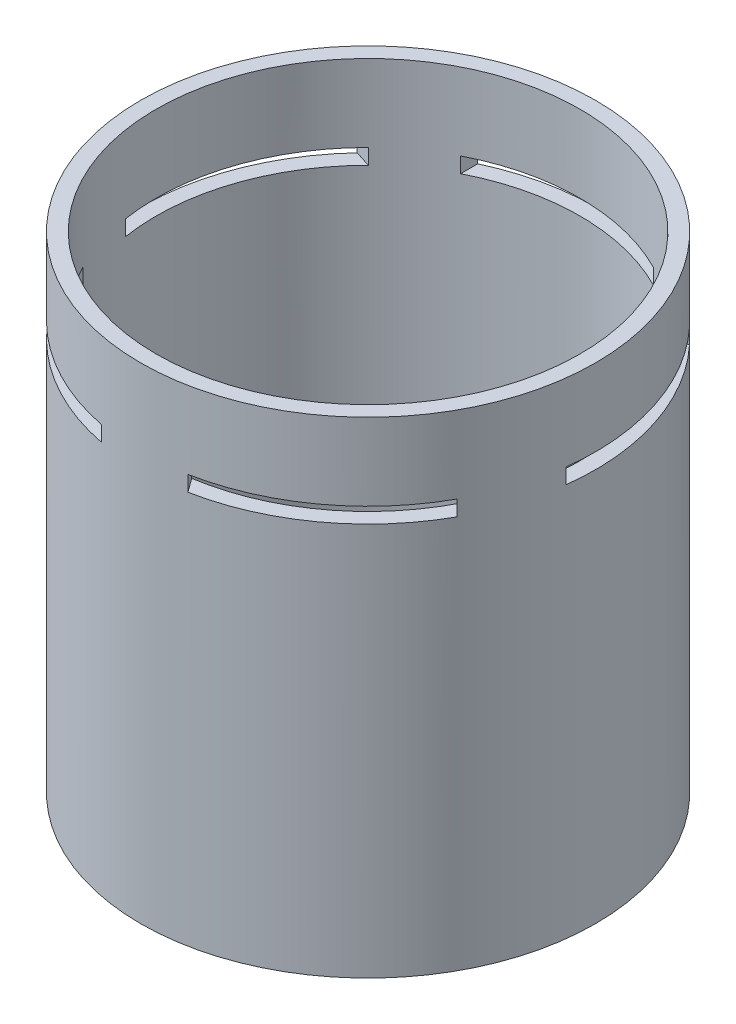
ISO-10303-21;
HEADER;
FILE_DESCRIPTION(('STEP AP214'),'2;1');
FILE_NAME('part.step','',(''),(''),'','','');
FILE_SCHEMA(('AUTOMOTIVE_DESIGN { 1 0 10303 214 1 1 1 1 }'));
ENDSEC;
DATA;
#1=APPLICATION_CONTEXT('core data for automotive mechanical design processes');
#2=APPLICATION_PROTOCOL_DEFINITION('international standard','automotive_design',2000,#1);
#3=PRODUCT_CONTEXT('',#1,'mechanical');
#4=PRODUCT('Part','Part','',(#3));
#5=PRODUCT_RELATED_PRODUCT_CATEGORY('part','',(#4));
#6=PRODUCT_DEFINITION_FORMATION('','',#4);
#7=PRODUCT_DEFINITION_CONTEXT('part definition',#1,'design');
#8=PRODUCT_DEFINITION('design','',#6,#7);
#9=PRODUCT_DEFINITION_SHAPE('','',#8);
#10=(LENGTH_UNIT() NAMED_UNIT(*) SI_UNIT(.MILLI.,.METRE.));
#11=(NAMED_UNIT(*) PLANE_ANGLE_UNIT() SI_UNIT($,.RADIAN.));
#12=(NAMED_UNIT(*) SI_UNIT($,.STERADIAN.) SOLID_ANGLE_UNIT());
#13=UNCERTAINTY_MEASURE_WITH_UNIT(LENGTH_MEASURE(1.E-05),#10,'distance_accuracy_value','');
#14=(GEOMETRIC_REPRESENTATION_CONTEXT(3) GLOBAL_UNCERTAINTY_ASSIGNED_CONTEXT((#13)) GLOBAL_UNIT_ASSIGNED_CONTEXT((#10,
#11,#12)) REPRESENTATION_CONTEXT('',''));
#15=CARTESIAN_POINT('',(0.,0.,0.));
#16=DIRECTION('',(0.,0.,1.));
#17=DIRECTION('',(1.,0.,0.));
#18=AXIS2_PLACEMENT_3D('',#15,#16,#17);
#19=CARTESIAN_POINT('',(0.,63.,0.));
#20=DIRECTION('',(0.,1.,0.));
#21=DIRECTION('',(0.,0.,1.));
#22=AXIS2_PLACEMENT_3D('',#19,#20,#21);
#23=PLANE('',#22);
#24=CARTESIAN_POINT('',(0.,63.,0.));
#25=DIRECTION('',(0.,1.,0.));
#26=DIRECTION('',(0.,0.,1.));
#27=AXIS2_PLACEMENT_3D('',#24,#25,#26);
#28=CIRCLE('',#27,29.5);
#29=CARTESIAN_POINT('',(0.,63.,29.5));
#30=VERTEX_POINT('',#29);
#31=EDGE_CURVE('E319',#30,#30,#28,.T.);
#32=ORIENTED_EDGE('',*,*,#31,.T.);
#33=EDGE_LOOP('',(#32));
#34=FACE_BOUND('',#33,.T.);
#35=CARTESIAN_POINT('',(0.,63.,0.));
#36=DIRECTION('',(0.,1.,0.));
#37=DIRECTION('',(0.,0.,1.));
#38=AXIS2_PLACEMENT_3D('',#35,#36,#37);
#39=CIRCLE('',#38,27.5);
#40=CARTESIAN_POINT('',(0.,63.,27.5));
#41=VERTEX_POINT('',#40);
#42=EDGE_CURVE('E313',#41,#41,#39,.T.);
#43=ORIENTED_EDGE('',*,*,#42,.F.);
#44=EDGE_LOOP('',(#43));
#45=FACE_BOUND('',#44,.T.);
#46=ADVANCED_FACE('F33',(#34,#45),#23,.T.);
#47=CARTESIAN_POINT('',(0.,0.,0.));
#48=DIRECTION('',(0.,1.,0.));
#49=DIRECTION('',(0.,0.,1.));
#50=AXIS2_PLACEMENT_3D('',#47,#48,#49);
#51=PLANE('',#50);
#52=CARTESIAN_POINT('',(0.,0.,0.));
#53=DIRECTION('',(0.,1.,0.));
#54=DIRECTION('',(0.,0.,1.));
#55=AXIS2_PLACEMENT_3D('',#52,#53,#54);
#56=CIRCLE('',#55,29.5);
#57=CARTESIAN_POINT('',(0.,0.,29.5));
#58=VERTEX_POINT('',#57);
#59=EDGE_CURVE('E316',#58,#58,#56,.T.);
#60=ORIENTED_EDGE('',*,*,#59,.F.);
#61=EDGE_LOOP('',(#60));
#62=FACE_BOUND('',#61,.T.);
#63=CARTESIAN_POINT('',(0.,0.,0.));
#64=DIRECTION('',(0.,1.,0.));
#65=DIRECTION('',(0.,0.,1.));
#66=AXIS2_PLACEMENT_3D('',#63,#64,#65);
#67=CIRCLE('',#66,27.5);
#68=CARTESIAN_POINT('',(0.,0.,27.5));
#69=VERTEX_POINT('',#68);
#70=EDGE_CURVE('E312',#69,#69,#67,.T.);
#71=ORIENTED_EDGE('',*,*,#70,.T.);
#72=EDGE_LOOP('',(#71));
#73=FACE_BOUND('',#72,.T.);
#74=ADVANCED_FACE('F359',(#62,#73),#51,.F.);
#75=CARTESIAN_POINT('',(0.,63.,0.));
#76=DIRECTION('',(0.,-1.,0.));
#77=DIRECTION('',(0.,0.,-1.));
#78=AXIS2_PLACEMENT_3D('',#75,#76,#77);
#79=CYLINDRICAL_SURFACE('',#78,29.5);
#80=DIRECTION('',(0.,-1.,0.));
#81=VECTOR('',#80,1.);
#82=CARTESIAN_POINT('',(29.2756828777052,63.,3.63103181534354));
#83=LINE('',#82,#81);
#84=CARTESIAN_POINT('',(29.2756828777052,51.,3.63103181534354));
#85=VERTEX_POINT('',#84);
#86=CARTESIAN_POINT('',(29.2756828777052,53.,3.63103181534355));
#87=VERTEX_POINT('',#86);
#88=EDGE_CURVE('E282',#85,#87,#83,.F.);
#89=ORIENTED_EDGE('',*,*,#88,.T.);
#90=CARTESIAN_POINT('',(0.,53.,0.));
#91=DIRECTION('',(0.,1.,0.));
#92=DIRECTION('',(0.,0.,1.));
#93=AXIS2_PLACEMENT_3D('',#90,#91,#92);
#94=CIRCLE('',#93,29.5);
#95=CARTESIAN_POINT('',(21.5502580183316,53.,-20.1453810920353));
#96=VERTEX_POINT('',#95);
#97=EDGE_CURVE('E252',#87,#96,#94,.T.);
#98=ORIENTED_EDGE('',*,*,#97,.T.);
#99=DIRECTION('',(0.,-1.,0.));
#100=VECTOR('',#99,1.);
#101=CARTESIAN_POINT('',(21.5502580183316,63.,-20.1453810920353));
#102=LINE('',#101,#100);
#103=CARTESIAN_POINT('',(21.5502580183316,51.,-20.1453810920353));
#104=VERTEX_POINT('',#103);
#105=EDGE_CURVE('E278',#96,#104,#102,.T.);
#106=ORIENTED_EDGE('',*,*,#105,.T.);
#107=CARTESIAN_POINT('',(0.,51.,0.));
#108=DIRECTION('',(0.,-1.,0.));
#109=DIRECTION('',(0.,0.,-1.));
#110=AXIS2_PLACEMENT_3D('',#107,#108,#109);
#111=CIRCLE('',#110,29.5);
#112=EDGE_CURVE('E237',#104,#85,#111,.T.);
#113=ORIENTED_EDGE('',*,*,#112,.T.);
#114=EDGE_LOOP('',(#89,#98,#106,#113));
#115=FACE_BOUND('',#114,.T.);
#116=CARTESIAN_POINT('',(25.8187919216588,51.,14.2702482005776));
#117=VERTEX_POINT('',#116);
#118=CARTESIAN_POINT('',(5.593367062285,51.,28.9648795078893));
#119=VERTEX_POINT('',#118);
#120=EDGE_CURVE('E535',#117,#119,#111,.T.);
#121=ORIENTED_EDGE('',*,*,#120,.T.);
#122=DIRECTION('',(0.,-1.,0.));
#123=VECTOR('',#122,1.);
#124=CARTESIAN_POINT('',(5.593367062285,63.,28.9648795078893));
#125=LINE('',#124,#123);
#126=CARTESIAN_POINT('',(5.593367062285,53.,28.9648795078893));
#127=VERTEX_POINT('',#126);
#128=EDGE_CURVE('E275',#119,#127,#125,.F.);
#129=ORIENTED_EDGE('',*,*,#128,.T.);
#130=CARTESIAN_POINT('',(25.8187919216588,53.,14.2702482005776));
#131=VERTEX_POINT('',#130);
#132=EDGE_CURVE('E288',#127,#131,#94,.T.);
#133=ORIENTED_EDGE('',*,*,#132,.T.);
#134=DIRECTION('',(0.,-1.,0.));
#135=VECTOR('',#134,1.);
#136=CARTESIAN_POINT('',(25.8187919216588,63.,14.2702482005776));
#137=LINE('',#136,#135);
#138=EDGE_CURVE('E272',#131,#117,#137,.T.);
#139=ORIENTED_EDGE('',*,*,#138,.T.);
#140=EDGE_LOOP('',(#121,#129,#133,#139));
#141=FACE_BOUND('',#140,.T.);
#142=CARTESIAN_POINT('',(-5.59336706228543,51.,28.9648795078892));
#143=VERTEX_POINT('',#142);
#144=CARTESIAN_POINT('',(-25.818791921659,51.,14.2702482005772));
#145=VERTEX_POINT('',#144);
#146=EDGE_CURVE('E281',#143,#145,#111,.T.);
#147=ORIENTED_EDGE('',*,*,#146,.T.);
#148=DIRECTION('',(0.,-1.,0.));
#149=VECTOR('',#148,1.);
#150=CARTESIAN_POINT('',(-25.818791921659,63.,14.2702482005772));
#151=LINE('',#150,#149);
#152=CARTESIAN_POINT('',(-25.818791921659,53.,14.2702482005772));
#153=VERTEX_POINT('',#152);
#154=EDGE_CURVE('E269',#145,#153,#151,.F.);
#155=ORIENTED_EDGE('',*,*,#154,.T.);
#156=CARTESIAN_POINT('',(-5.59336706228543,53.,28.9648795078892));
#157=VERTEX_POINT('',#156);
#158=EDGE_CURVE('E284',#153,#157,#94,.T.);
#159=ORIENTED_EDGE('',*,*,#158,.T.);
#160=DIRECTION('',(0.,-1.,0.));
#161=VECTOR('',#160,1.);
#162=CARTESIAN_POINT('',(-5.59336706228543,63.,28.9648795078892));
#163=LINE('',#162,#161);
#164=EDGE_CURVE('E266',#157,#143,#163,.T.);
#165=ORIENTED_EDGE('',*,*,#164,.T.);
#166=EDGE_LOOP('',(#147,#155,#159,#165));
#167=FACE_BOUND('',#166,.T.);
#168=CARTESIAN_POINT('',(-29.2756828777053,51.,3.63103181534312));
#169=VERTEX_POINT('',#168);
#170=CARTESIAN_POINT('',(-21.5502580183313,51.,-20.1453810920356));
#171=VERTEX_POINT('',#170);
#172=EDGE_CURVE('E191',#169,#171,#111,.T.);
#173=ORIENTED_EDGE('',*,*,#172,.T.);
#174=DIRECTION('',(0.,-1.,0.));
#175=VECTOR('',#174,1.);
#176=CARTESIAN_POINT('',(-21.5502580183313,63.,-20.1453810920356));
#177=LINE('',#176,#175);
#178=CARTESIAN_POINT('',(-21.5502580183313,53.,-20.1453810920356));
#179=VERTEX_POINT('',#178);
#180=EDGE_CURVE('E255',#171,#179,#177,.F.);
#181=ORIENTED_EDGE('',*,*,#180,.T.);
#182=CARTESIAN_POINT('',(-29.2756828777053,53.,3.63103181534312));
#183=VERTEX_POINT('',#182);
#184=EDGE_CURVE('E287',#179,#183,#94,.T.);
#185=ORIENTED_EDGE('',*,*,#184,.T.);
#186=DIRECTION('',(0.,-1.,0.));
#187=VECTOR('',#186,1.);
#188=CARTESIAN_POINT('',(-29.2756828777053,63.,3.63103181534312));
#189=LINE('',#188,#187);
#190=EDGE_CURVE('E253',#183,#169,#189,.T.);
#191=ORIENTED_EDGE('',*,*,#190,.T.);
#192=EDGE_LOOP('',(#173,#181,#185,#191));
#193=FACE_BOUND('',#192,.T.);
#194=DIRECTION('',(0.,-1.,0.));
#195=VECTOR('',#194,1.);
#196=CARTESIAN_POINT('',(12.5,63.,-26.7207784317748));
#197=LINE('',#196,#195);
#198=CARTESIAN_POINT('',(12.5,51.,-26.7207784317748));
#199=VERTEX_POINT('',#198);
#200=CARTESIAN_POINT('',(12.5,53.,-26.7207784317748));
#201=VERTEX_POINT('',#200);
#202=EDGE_CURVE('E306',#199,#201,#197,.F.);
#203=ORIENTED_EDGE('',*,*,#202,.T.);
#204=CARTESIAN_POINT('',(0.,53.,0.));
#205=DIRECTION('',(0.,1.,0.));
#206=DIRECTION('',(0.,0.,1.));
#207=AXIS2_PLACEMENT_3D('',#204,#205,#206);
#208=CIRCLE('',#207,29.5);
#209=CARTESIAN_POINT('',(-12.5,53.,-26.7207784317748));
#210=VERTEX_POINT('',#209);
#211=EDGE_CURVE('E309',#201,#210,#208,.T.);
#212=ORIENTED_EDGE('',*,*,#211,.T.);
#213=DIRECTION('',(0.,-1.,0.));
#214=VECTOR('',#213,1.);
#215=CARTESIAN_POINT('',(-12.5,63.,-26.7207784317748));
#216=LINE('',#215,#214);
#217=CARTESIAN_POINT('',(-12.5,51.,-26.7207784317748));
#218=VERTEX_POINT('',#217);
#219=EDGE_CURVE('E292',#210,#218,#216,.T.);
#220=ORIENTED_EDGE('',*,*,#219,.T.);
#221=CARTESIAN_POINT('',(0.,51.,0.));
#222=DIRECTION('',(0.,-1.,0.));
#223=DIRECTION('',(0.,0.,-1.));
#224=AXIS2_PLACEMENT_3D('',#221,#222,#223);
#225=CIRCLE('',#224,29.5);
#226=EDGE_CURVE('E303',#218,#199,#225,.T.);
#227=ORIENTED_EDGE('',*,*,#226,.T.);
#228=EDGE_LOOP('',(#203,#212,#220,#227));
#229=FACE_BOUND('',#228,.T.);
#230=ORIENTED_EDGE('',*,*,#31,.F.);
#231=EDGE_LOOP('',(#230));
#232=FACE_BOUND('',#231,.T.);
#233=ORIENTED_EDGE('',*,*,#59,.T.);
#234=EDGE_LOOP('',(#233));
#235=FACE_BOUND('',#234,.T.);
#236=ADVANCED_FACE('F35',(#115,#141,#167,#193,#229,#232,#235),#79,.T.);
#237=CARTESIAN_POINT('',(0.,63.,0.));
#238=DIRECTION('',(0.,-1.,0.));
#239=DIRECTION('',(0.,0.,-1.));
#240=AXIS2_PLACEMENT_3D('',#237,#238,#239);
#241=CYLINDRICAL_SURFACE('',#240,27.5);
#242=CARTESIAN_POINT('',(0.,53.,0.));
#243=DIRECTION('',(0.,1.,0.));
#244=DIRECTION('',(0.,0.,1.));
#245=AXIS2_PLACEMENT_3D('',#242,#243,#244);
#246=CIRCLE('',#245,27.5);
#247=CARTESIAN_POINT('',(27.1587442444076,53.,4.31886687301829));
#248=VERTEX_POINT('',#247);
#249=CARTESIAN_POINT('',(19.433319385034,53.,-19.4575460343606));
#250=VERTEX_POINT('',#249);
#251=EDGE_CURVE('E11',#248,#250,#246,.T.);
#252=ORIENTED_EDGE('',*,*,#251,.F.);
#253=DIRECTION('',(0.,-1.,0.));
#254=VECTOR('',#253,1.);
#255=CARTESIAN_POINT('',(27.1587442444076,63.,4.31886687301829));
#256=LINE('',#255,#254);
#257=CARTESIAN_POINT('',(27.1587442444076,51.,4.31886687301829));
#258=VERTEX_POINT('',#257);
#259=EDGE_CURVE('E37',#258,#248,#256,.F.);
#260=ORIENTED_EDGE('',*,*,#259,.F.);
#261=CARTESIAN_POINT('',(0.,51.,0.));
#262=DIRECTION('',(0.,-1.,0.));
#263=DIRECTION('',(0.,0.,-1.));
#264=AXIS2_PLACEMENT_3D('',#261,#262,#263);
#265=CIRCLE('',#264,27.5);
#266=CARTESIAN_POINT('',(19.433319385034,51.,-19.4575460343606));
#267=VERTEX_POINT('',#266);
#268=EDGE_CURVE('E200',#267,#258,#265,.T.);
#269=ORIENTED_EDGE('',*,*,#268,.F.);
#270=DIRECTION('',(0.,-1.,0.));
#271=VECTOR('',#270,1.);
#272=CARTESIAN_POINT('',(19.433319385034,63.,-19.4575460343606));
#273=LINE('',#272,#271);
#274=EDGE_CURVE('E203',#250,#267,#273,.T.);
#275=ORIENTED_EDGE('',*,*,#274,.F.);
#276=EDGE_LOOP('',(#252,#260,#269,#275));
#277=FACE_BOUND('',#276,.T.);
#278=DIRECTION('',(0.,-1.,0.));
#279=VECTOR('',#278,1.);
#280=CARTESIAN_POINT('',(4.28502703480935,63.,27.164103948243));
#281=LINE('',#280,#279);
#282=CARTESIAN_POINT('',(4.28502703480935,51.,27.164103948243));
#283=VERTEX_POINT('',#282);
#284=CARTESIAN_POINT('',(4.28502703480935,53.,27.164103948243));
#285=VERTEX_POINT('',#284);
#286=EDGE_CURVE('E220',#283,#285,#281,.F.);
#287=ORIENTED_EDGE('',*,*,#286,.F.);
#288=CARTESIAN_POINT('',(24.5104518941831,51.,12.4694726409313));
#289=VERTEX_POINT('',#288);
#290=EDGE_CURVE('E204',#289,#283,#265,.T.);
#291=ORIENTED_EDGE('',*,*,#290,.F.);
#292=DIRECTION('',(0.,-1.,0.));
#293=VECTOR('',#292,1.);
#294=CARTESIAN_POINT('',(24.5104518941831,63.,12.4694726409313));
#295=LINE('',#294,#293);
#296=CARTESIAN_POINT('',(24.5104518941831,53.,12.4694726409313));
#297=VERTEX_POINT('',#296);
#298=EDGE_CURVE('E214',#297,#289,#295,.T.);
#299=ORIENTED_EDGE('',*,*,#298,.F.);
#300=EDGE_CURVE('E43',#285,#297,#246,.T.);
#301=ORIENTED_EDGE('',*,*,#300,.F.);
#302=EDGE_LOOP('',(#287,#291,#299,#301));
#303=FACE_BOUND('',#302,.T.);
#304=DIRECTION('',(0.,-1.,0.));
#305=VECTOR('',#304,1.);
#306=CARTESIAN_POINT('',(-24.5104518941833,63.,12.469472640931));
#307=LINE('',#306,#305);
#308=CARTESIAN_POINT('',(-24.5104518941833,51.,12.469472640931));
#309=VERTEX_POINT('',#308);
#310=CARTESIAN_POINT('',(-24.5104518941833,53.,12.469472640931));
#311=VERTEX_POINT('',#310);
#312=EDGE_CURVE('E212',#309,#311,#307,.F.);
#313=ORIENTED_EDGE('',*,*,#312,.F.);
#314=CARTESIAN_POINT('',(-4.28502703480975,51.,27.164103948243));
#315=VERTEX_POINT('',#314);
#316=EDGE_CURVE('E201',#315,#309,#265,.T.);
#317=ORIENTED_EDGE('',*,*,#316,.F.);
#318=DIRECTION('',(0.,-1.,0.));
#319=VECTOR('',#318,1.);
#320=CARTESIAN_POINT('',(-4.28502703480975,63.,27.164103948243));
#321=LINE('',#320,#319);
#322=CARTESIAN_POINT('',(-4.28502703480975,53.,27.164103948243));
#323=VERTEX_POINT('',#322);
#324=EDGE_CURVE('E205',#323,#315,#321,.T.);
#325=ORIENTED_EDGE('',*,*,#324,.F.);
#326=EDGE_CURVE('E202',#311,#323,#246,.T.);
#327=ORIENTED_EDGE('',*,*,#326,.F.);
#328=EDGE_LOOP('',(#313,#317,#325,#327));
#329=FACE_BOUND('',#328,.T.);
#330=DIRECTION('',(0.,-1.,0.));
#331=VECTOR('',#330,1.);
#332=CARTESIAN_POINT('',(-19.4333193850337,63.,-19.4575460343608));
#333=LINE('',#332,#331);
#334=CARTESIAN_POINT('',(-19.4333193850337,51.,-19.4575460343608));
#335=VERTEX_POINT('',#334);
#336=CARTESIAN_POINT('',(-19.4333193850337,53.,-19.4575460343608));
#337=VERTEX_POINT('',#336);
#338=EDGE_CURVE('E198',#335,#337,#333,.F.);
#339=ORIENTED_EDGE('',*,*,#338,.F.);
#340=CARTESIAN_POINT('',(-27.1587442444077,51.,4.3188668730179));
#341=VERTEX_POINT('',#340);
#342=EDGE_CURVE('E183',#341,#335,#265,.T.);
#343=ORIENTED_EDGE('',*,*,#342,.F.);
#344=DIRECTION('',(0.,-1.,0.));
#345=VECTOR('',#344,1.);
#346=CARTESIAN_POINT('',(-27.1587442444077,63.,4.3188668730179));
#347=LINE('',#346,#345);
#348=CARTESIAN_POINT('',(-27.1587442444077,53.,4.3188668730179));
#349=VERTEX_POINT('',#348);
#350=EDGE_CURVE('E172',#349,#341,#347,.T.);
#351=ORIENTED_EDGE('',*,*,#350,.F.);
#352=EDGE_CURVE('E44',#337,#349,#246,.T.);
#353=ORIENTED_EDGE('',*,*,#352,.F.);
#354=EDGE_LOOP('',(#339,#343,#351,#353));
#355=FACE_BOUND('',#354,.T.);
#356=CARTESIAN_POINT('',(0.,53.,0.));
#357=DIRECTION('',(0.,1.,0.));
#358=DIRECTION('',(0.,0.,1.));
#359=AXIS2_PLACEMENT_3D('',#356,#357,#358);
#360=CIRCLE('',#359,27.5);
#361=CARTESIAN_POINT('',(12.5,53.,-24.4948974278318));
#362=VERTEX_POINT('',#361);
#363=CARTESIAN_POINT('',(-12.5,53.,-24.4948974278318));
#364=VERTEX_POINT('',#363);
#365=EDGE_CURVE('E184',#362,#364,#360,.T.);
#366=ORIENTED_EDGE('',*,*,#365,.F.);
#367=DIRECTION('',(0.,-1.,0.));
#368=VECTOR('',#367,1.);
#369=CARTESIAN_POINT('',(12.5,63.,-24.4948974278318));
#370=LINE('',#369,#368);
#371=CARTESIAN_POINT('',(12.5,51.,-24.4948974278318));
#372=VERTEX_POINT('',#371);
#373=EDGE_CURVE('E328',#372,#362,#370,.F.);
#374=ORIENTED_EDGE('',*,*,#373,.F.);
#375=CARTESIAN_POINT('',(0.,51.,0.));
#376=DIRECTION('',(0.,-1.,0.));
#377=DIRECTION('',(0.,0.,-1.));
#378=AXIS2_PLACEMENT_3D('',#375,#376,#377);
#379=CIRCLE('',#378,27.5);
#380=CARTESIAN_POINT('',(-12.5,51.,-24.4948974278318));
#381=VERTEX_POINT('',#380);
#382=EDGE_CURVE('E326',#381,#372,#379,.T.);
#383=ORIENTED_EDGE('',*,*,#382,.F.);
#384=DIRECTION('',(0.,-1.,0.));
#385=VECTOR('',#384,1.);
#386=CARTESIAN_POINT('',(-12.5,63.,-24.4948974278318));
#387=LINE('',#386,#385);
#388=EDGE_CURVE('E322',#364,#381,#387,.T.);
#389=ORIENTED_EDGE('',*,*,#388,.F.);
#390=EDGE_LOOP('',(#366,#374,#383,#389));
#391=FACE_BOUND('',#390,.T.);
#392=ORIENTED_EDGE('',*,*,#42,.T.);
#393=EDGE_LOOP('',(#392));
#394=FACE_BOUND('',#393,.T.);
#395=ORIENTED_EDGE('',*,*,#70,.F.);
#396=EDGE_LOOP('',(#395));
#397=FACE_BOUND('',#396,.T.);
#398=ADVANCED_FACE('F196',(#277,#303,#329,#355,#391,#394,#397),#241,.F.);
#399=CARTESIAN_POINT('',(0.,53.,-33.));
#400=DIRECTION('',(0.,1.,0.));
#401=DIRECTION('',(0.,0.,1.));
#402=AXIS2_PLACEMENT_3D('',#399,#400,#401);
#403=PLANE('',#402);
#404=DIRECTION('',(0.,0.,1.));
#405=VECTOR('',#404,1.);
#406=CARTESIAN_POINT('',(12.5,53.,-33.));
#407=LINE('',#406,#405);
#408=EDGE_CURVE('E289',#201,#362,#407,.T.);
#409=ORIENTED_EDGE('',*,*,#408,.T.);
#410=ORIENTED_EDGE('',*,*,#365,.T.);
#411=DIRECTION('',(0.,0.,1.));
#412=VECTOR('',#411,1.);
#413=CARTESIAN_POINT('',(-12.5,53.,-33.));
#414=LINE('',#413,#412);
#415=EDGE_CURVE('E299',#210,#364,#414,.T.);
#416=ORIENTED_EDGE('',*,*,#415,.F.);
#417=ORIENTED_EDGE('',*,*,#211,.F.);
#418=EDGE_LOOP('',(#409,#410,#416,#417));
#419=FACE_BOUND('',#418,.T.);
#420=ADVANCED_FACE('F335',(#419),#403,.F.);
#421=CARTESIAN_POINT('',(12.5,53.,-33.));
#422=DIRECTION('',(1.,0.,0.));
#423=DIRECTION('',(0.,0.,-1.));
#424=AXIS2_PLACEMENT_3D('',#421,#422,#423);
#425=PLANE('',#424);
#426=DIRECTION('',(0.,0.,1.));
#427=VECTOR('',#426,1.);
#428=CARTESIAN_POINT('',(12.5,51.,-33.));
#429=LINE('',#428,#427);
#430=EDGE_CURVE('E293',#199,#372,#429,.T.);
#431=ORIENTED_EDGE('',*,*,#430,.T.);
#432=ORIENTED_EDGE('',*,*,#373,.T.);
#433=ORIENTED_EDGE('',*,*,#408,.F.);
#434=ORIENTED_EDGE('',*,*,#202,.F.);
#435=EDGE_LOOP('',(#431,#432,#433,#434));
#436=FACE_BOUND('',#435,.T.);
#437=ADVANCED_FACE('F349',(#436),#425,.F.);
#438=CARTESIAN_POINT('',(12.5,51.,-33.));
#439=DIRECTION('',(0.,-1.,0.));
#440=DIRECTION('',(0.,0.,-1.));
#441=AXIS2_PLACEMENT_3D('',#438,#439,#440);
#442=PLANE('',#441);
#443=DIRECTION('',(0.,0.,1.));
#444=VECTOR('',#443,1.);
#445=CARTESIAN_POINT('',(-12.5,51.,-33.));
#446=LINE('',#445,#444);
#447=EDGE_CURVE('E296',#218,#381,#446,.T.);
#448=ORIENTED_EDGE('',*,*,#447,.T.);
#449=ORIENTED_EDGE('',*,*,#382,.T.);
#450=ORIENTED_EDGE('',*,*,#430,.F.);
#451=ORIENTED_EDGE('',*,*,#226,.F.);
#452=EDGE_LOOP('',(#448,#449,#450,#451));
#453=FACE_BOUND('',#452,.T.);
#454=ADVANCED_FACE('F344',(#453),#442,.F.);
#455=CARTESIAN_POINT('',(-12.5,51.,-33.));
#456=DIRECTION('',(-1.,0.,0.));
#457=DIRECTION('',(0.,0.,1.));
#458=AXIS2_PLACEMENT_3D('',#455,#456,#457);
#459=PLANE('',#458);
#460=ORIENTED_EDGE('',*,*,#415,.T.);
#461=ORIENTED_EDGE('',*,*,#388,.T.);
#462=ORIENTED_EDGE('',*,*,#447,.F.);
#463=ORIENTED_EDGE('',*,*,#219,.F.);
#464=EDGE_LOOP('',(#460,#461,#462,#463));
#465=FACE_BOUND('',#464,.T.);
#466=ADVANCED_FACE('F341',(#465),#459,.F.);
#467=CARTESIAN_POINT('',(-27.522152608053,53.,-22.085767268063));
#468=DIRECTION('',(0.309016994374958,0.,-0.95105651629515));
#469=DIRECTION('',(-0.95105651629515,0.,-0.309016994374958));
#470=AXIS2_PLACEMENT_3D('',#467,#468,#469);
#471=PLANE('',#470);
#472=DIRECTION('',(0.95105651629515,0.,0.309016994374958));
#473=VECTOR('',#472,1.);
#474=CARTESIAN_POINT('',(-27.522152608053,51.,-22.085767268063));
#475=LINE('',#474,#473);
#476=EDGE_CURVE('E193',#171,#335,#475,.T.);
#477=ORIENTED_EDGE('',*,*,#476,.T.);
#478=ORIENTED_EDGE('',*,*,#338,.T.);
#479=DIRECTION('',(0.95105651629515,0.,0.309016994374958));
#480=VECTOR('',#479,1.);
#481=CARTESIAN_POINT('',(-27.522152608053,53.,-22.085767268063));
#482=LINE('',#481,#480);
#483=EDGE_CURVE('E554',#179,#337,#482,.T.);
#484=ORIENTED_EDGE('',*,*,#483,.F.);
#485=ORIENTED_EDGE('',*,*,#180,.F.);
#486=EDGE_LOOP('',(#477,#478,#484,#485));
#487=FACE_BOUND('',#486,.T.);
#488=ADVANCED_FACE('F371',(#487),#471,.F.);
#489=CARTESIAN_POINT('',(-35.2475774674269,51.,1.69064563931575));
#490=DIRECTION('',(-0.309016994374958,0.,0.95105651629515));
#491=DIRECTION('',(0.95105651629515,0.,0.309016994374958));
#492=AXIS2_PLACEMENT_3D('',#489,#490,#491);
#493=PLANE('',#492);
#494=DIRECTION('',(0.95105651629515,0.,0.309016994374958));
#495=VECTOR('',#494,1.);
#496=CARTESIAN_POINT('',(-35.2475774674269,53.,1.69064563931575));
#497=LINE('',#496,#495);
#498=EDGE_CURVE('E178',#183,#349,#497,.T.);
#499=ORIENTED_EDGE('',*,*,#498,.T.);
#500=ORIENTED_EDGE('',*,*,#350,.T.);
#501=DIRECTION('',(0.95105651629515,0.,0.309016994374958));
#502=VECTOR('',#501,1.);
#503=CARTESIAN_POINT('',(-35.2475774674269,51.,1.69064563931575));
#504=LINE('',#503,#502);
#505=EDGE_CURVE('E175',#169,#341,#504,.T.);
#506=ORIENTED_EDGE('',*,*,#505,.F.);
#507=ORIENTED_EDGE('',*,*,#190,.F.);
#508=EDGE_LOOP('',(#499,#500,#506,#507));
#509=FACE_BOUND('',#508,.T.);
#510=ADVANCED_FACE('F174',(#509),#493,.F.);
#511=CARTESIAN_POINT('',(35.2475774674269,51.,1.69064563931626));
#512=DIRECTION('',(0.,-1.,0.));
#513=DIRECTION('',(0.,0.,-1.));
#514=AXIS2_PLACEMENT_3D('',#511,#512,#513);
#515=PLANE('',#514);
#516=ORIENTED_EDGE('',*,*,#505,.T.);
#517=ORIENTED_EDGE('',*,*,#342,.T.);
#518=ORIENTED_EDGE('',*,*,#476,.F.);
#519=ORIENTED_EDGE('',*,*,#172,.F.);
#520=EDGE_LOOP('',(#516,#517,#518,#519));
#521=FACE_BOUND('',#520,.T.);
#522=ADVANCED_FACE('F187',(#521),#515,.F.);
#523=CARTESIAN_POINT('',(31.3848650377401,53.,-10.1975608143732));
#524=DIRECTION('',(0.,1.,0.));
#525=DIRECTION('',(0.,0.,1.));
#526=AXIS2_PLACEMENT_3D('',#523,#524,#525);
#527=PLANE('',#526);
#528=ORIENTED_EDGE('',*,*,#483,.T.);
#529=ORIENTED_EDGE('',*,*,#352,.T.);
#530=ORIENTED_EDGE('',*,*,#498,.F.);
#531=ORIENTED_EDGE('',*,*,#184,.F.);
#532=EDGE_LOOP('',(#528,#529,#530,#531));
#533=FACE_BOUND('',#532,.T.);
#534=ADVANCED_FACE('F386',(#533),#527,.F.);
#535=CARTESIAN_POINT('',(-29.5096257553386,53.,19.3502451607171));
#536=DIRECTION('',(-0.809016994374942,0.,-0.58778525229248));
#537=DIRECTION('',(-0.58778525229248,0.,0.809016994374942));
#538=AXIS2_PLACEMENT_3D('',#535,#536,#537);
#539=PLANE('',#538);
#540=DIRECTION('',(0.58778525229248,0.,-0.809016994374942));
#541=VECTOR('',#540,1.);
#542=CARTESIAN_POINT('',(-29.5096257553386,51.,19.3502451607171));
#543=LINE('',#542,#541);
#544=EDGE_CURVE('E548',#145,#309,#543,.T.);
#545=ORIENTED_EDGE('',*,*,#544,.T.);
#546=ORIENTED_EDGE('',*,*,#312,.T.);
#547=DIRECTION('',(0.58778525229248,0.,-0.809016994374942));
#548=VECTOR('',#547,1.);
#549=CARTESIAN_POINT('',(-29.5096257553386,53.,19.3502451607171));
#550=LINE('',#549,#548);
#551=EDGE_CURVE('E545',#153,#311,#550,.T.);
#552=ORIENTED_EDGE('',*,*,#551,.F.);
#553=ORIENTED_EDGE('',*,*,#154,.F.);
#554=EDGE_LOOP('',(#545,#546,#552,#553));
#555=FACE_BOUND('',#554,.T.);
#556=ADVANCED_FACE('F382',(#555),#539,.F.);
#557=CARTESIAN_POINT('',(-9.28420089596507,51.,34.0448764680291));
#558=DIRECTION('',(0.809016994374942,0.,0.58778525229248));
#559=DIRECTION('',(0.58778525229248,0.,-0.809016994374942));
#560=AXIS2_PLACEMENT_3D('',#557,#558,#559);
#561=PLANE('',#560);
#562=DIRECTION('',(0.58778525229248,0.,-0.809016994374942));
#563=VECTOR('',#562,1.);
#564=CARTESIAN_POINT('',(-9.28420089596507,53.,34.0448764680291));
#565=LINE('',#564,#563);
#566=EDGE_CURVE('E552',#157,#323,#565,.T.);
#567=ORIENTED_EDGE('',*,*,#566,.T.);
#568=ORIENTED_EDGE('',*,*,#324,.T.);
#569=DIRECTION('',(0.58778525229248,0.,-0.809016994374942));
#570=VECTOR('',#569,1.);
#571=CARTESIAN_POINT('',(-9.28420089596507,51.,34.0448764680291));
#572=LINE('',#571,#570);
#573=EDGE_CURVE('E550',#143,#315,#572,.T.);
#574=ORIENTED_EDGE('',*,*,#573,.F.);
#575=ORIENTED_EDGE('',*,*,#164,.F.);
#576=EDGE_LOOP('',(#567,#568,#574,#575));
#577=FACE_BOUND('',#576,.T.);
#578=ADVANCED_FACE('F385',(#577),#561,.F.);
#579=ORIENTED_EDGE('',*,*,#573,.T.);
#580=ORIENTED_EDGE('',*,*,#316,.T.);
#581=ORIENTED_EDGE('',*,*,#544,.F.);
#582=ORIENTED_EDGE('',*,*,#146,.F.);
#583=EDGE_LOOP('',(#579,#580,#581,#582));
#584=FACE_BOUND('',#583,.T.);
#585=ADVANCED_FACE('F390',(#584),#515,.F.);
#586=ORIENTED_EDGE('',*,*,#551,.T.);
#587=ORIENTED_EDGE('',*,*,#326,.T.);
#588=ORIENTED_EDGE('',*,*,#566,.F.);
#589=ORIENTED_EDGE('',*,*,#158,.F.);
#590=EDGE_LOOP('',(#586,#587,#588,#589));
#591=FACE_BOUND('',#590,.T.);
#592=ADVANCED_FACE('F396',(#591),#527,.F.);
#593=CARTESIAN_POINT('',(9.28420089596457,53.,34.0448764680292));
#594=DIRECTION('',(-0.809016994374951,0.,0.587785252292469));
#595=DIRECTION('',(0.587785252292469,0.,0.809016994374951));
#596=AXIS2_PLACEMENT_3D('',#593,#594,#595);
#597=PLANE('',#596);
#598=DIRECTION('',(-0.587785252292469,0.,-0.809016994374951));
#599=VECTOR('',#598,1.);
#600=CARTESIAN_POINT('',(9.28420089596457,51.,34.0448764680292));
#601=LINE('',#600,#599);
#602=EDGE_CURVE('E557',#119,#283,#601,.T.);
#603=ORIENTED_EDGE('',*,*,#602,.T.);
#604=ORIENTED_EDGE('',*,*,#286,.T.);
#605=DIRECTION('',(-0.587785252292469,0.,-0.809016994374951));
#606=VECTOR('',#605,1.);
#607=CARTESIAN_POINT('',(9.28420089596457,53.,34.0448764680292));
#608=LINE('',#607,#606);
#609=EDGE_CURVE('E262',#127,#285,#608,.T.);
#610=ORIENTED_EDGE('',*,*,#609,.F.);
#611=ORIENTED_EDGE('',*,*,#128,.F.);
#612=EDGE_LOOP('',(#603,#604,#610,#611));
#613=FACE_BOUND('',#612,.T.);
#614=ADVANCED_FACE('F392',(#613),#597,.F.);
#615=CARTESIAN_POINT('',(29.5096257553383,51.,19.3502451607175));
#616=DIRECTION('',(0.809016994374951,0.,-0.587785252292469));
#617=DIRECTION('',(-0.587785252292469,0.,-0.809016994374951));
#618=AXIS2_PLACEMENT_3D('',#615,#616,#617);
#619=PLANE('',#618);
#620=DIRECTION('',(-0.587785252292469,0.,-0.809016994374951));
#621=VECTOR('',#620,1.);
#622=CARTESIAN_POINT('',(29.5096257553383,53.,19.3502451607175));
#623=LINE('',#622,#621);
#624=EDGE_CURVE('E259',#131,#297,#623,.T.);
#625=ORIENTED_EDGE('',*,*,#624,.T.);
#626=ORIENTED_EDGE('',*,*,#298,.T.);
#627=DIRECTION('',(-0.587785252292469,0.,-0.809016994374951));
#628=VECTOR('',#627,1.);
#629=CARTESIAN_POINT('',(29.5096257553383,51.,19.3502451607175));
#630=LINE('',#629,#628);
#631=EDGE_CURVE('E59',#117,#289,#630,.T.);
#632=ORIENTED_EDGE('',*,*,#631,.F.);
#633=ORIENTED_EDGE('',*,*,#138,.F.);
#634=EDGE_LOOP('',(#625,#626,#632,#633));
#635=FACE_BOUND('',#634,.T.);
#636=ADVANCED_FACE('F395',(#635),#619,.F.);
#637=ORIENTED_EDGE('',*,*,#631,.T.);
#638=ORIENTED_EDGE('',*,*,#290,.T.);
#639=ORIENTED_EDGE('',*,*,#602,.F.);
#640=ORIENTED_EDGE('',*,*,#120,.F.);
#641=EDGE_LOOP('',(#637,#638,#639,#640));
#642=FACE_BOUND('',#641,.T.);
#643=ADVANCED_FACE('F400',(#642),#515,.F.);
#644=ORIENTED_EDGE('',*,*,#609,.T.);
#645=ORIENTED_EDGE('',*,*,#300,.T.);
#646=ORIENTED_EDGE('',*,*,#624,.F.);
#647=ORIENTED_EDGE('',*,*,#132,.F.);
#648=EDGE_LOOP('',(#644,#645,#646,#647));
#649=FACE_BOUND('',#648,.T.);
#650=ADVANCED_FACE('F401',(#649),#527,.F.);
#651=DIRECTION('',(-0.951056516295154,0.,0.309016994374945));
#652=VECTOR('',#651,1.);
#653=CARTESIAN_POINT('',(35.2475774674269,53.,1.69064563931626));
#654=LINE('',#653,#652);
#655=EDGE_CURVE('E247',#87,#248,#654,.T.);
#656=ORIENTED_EDGE('',*,*,#655,.T.);
#657=ORIENTED_EDGE('',*,*,#251,.T.);
#658=DIRECTION('',(-0.951056516295154,0.,0.309016994374945));
#659=VECTOR('',#658,1.);
#660=CARTESIAN_POINT('',(27.5221526080533,53.,-22.0857672680626));
#661=LINE('',#660,#659);
#662=EDGE_CURVE('E228',#96,#250,#661,.T.);
#663=ORIENTED_EDGE('',*,*,#662,.F.);
#664=ORIENTED_EDGE('',*,*,#97,.F.);
#665=EDGE_LOOP('',(#656,#657,#663,#664));
#666=FACE_BOUND('',#665,.T.);
#667=ADVANCED_FACE('F250',(#666),#527,.F.);
#668=CARTESIAN_POINT('',(35.2475774674269,53.,1.69064563931626));
#669=DIRECTION('',(0.309016994374945,0.,0.951056516295154));
#670=DIRECTION('',(0.951056516295155,0.,-0.309016994374945));
#671=AXIS2_PLACEMENT_3D('',#668,#669,#670);
#672=PLANE('',#671);
#673=DIRECTION('',(-0.951056516295154,0.,0.309016994374945));
#674=VECTOR('',#673,1.);
#675=CARTESIAN_POINT('',(35.2475774674269,51.,1.69064563931626));
#676=LINE('',#675,#674);
#677=EDGE_CURVE('E239',#85,#258,#676,.T.);
#678=ORIENTED_EDGE('',*,*,#677,.T.);
#679=ORIENTED_EDGE('',*,*,#259,.T.);
#680=ORIENTED_EDGE('',*,*,#655,.F.);
#681=ORIENTED_EDGE('',*,*,#88,.F.);
#682=EDGE_LOOP('',(#678,#679,#680,#681));
#683=FACE_BOUND('',#682,.T.);
#684=ADVANCED_FACE('F246',(#683),#672,.F.);
#685=DIRECTION('',(-0.951056516295154,0.,0.309016994374945));
#686=VECTOR('',#685,1.);
#687=CARTESIAN_POINT('',(27.5221526080533,51.,-22.0857672680626));
#688=LINE('',#687,#686);
#689=EDGE_CURVE('E51',#104,#267,#688,.T.);
#690=ORIENTED_EDGE('',*,*,#689,.T.);
#691=ORIENTED_EDGE('',*,*,#268,.T.);
#692=ORIENTED_EDGE('',*,*,#677,.F.);
#693=ORIENTED_EDGE('',*,*,#112,.F.);
#694=EDGE_LOOP('',(#690,#691,#692,#693));
#695=FACE_BOUND('',#694,.T.);
#696=ADVANCED_FACE('F233',(#695),#515,.F.);
#697=CARTESIAN_POINT('',(27.5221526080533,51.,-22.0857672680626));
#698=DIRECTION('',(-0.309016994374945,0.,-0.951056516295154));
#699=DIRECTION('',(-0.951056516295155,0.,0.309016994374945));
#700=AXIS2_PLACEMENT_3D('',#697,#698,#699);
#701=PLANE('',#700);
#702=ORIENTED_EDGE('',*,*,#662,.T.);
#703=ORIENTED_EDGE('',*,*,#274,.T.);
#704=ORIENTED_EDGE('',*,*,#689,.F.);
#705=ORIENTED_EDGE('',*,*,#105,.F.);
#706=EDGE_LOOP('',(#702,#703,#704,#705));
#707=FACE_BOUND('',#706,.T.);
#708=ADVANCED_FACE('F226',(#707),#701,.F.);
#709=CLOSED_SHELL('',(#46,#74,#236,#398,#420,#437,#454,#466,#488,#510,#522,#534,#556,#578,#585,
#592,#614,#636,#643,#650,#667,#684,#696,#708));
#710=MANIFOLD_SOLID_BREP('B2',#709);
#711=ADVANCED_BREP_SHAPE_REPRESENTATION('',(#18,#710),#14);
#712=SHAPE_DEFINITION_REPRESENTATION(#9,#711);
ENDSEC;
END-ISO-10303-21;
